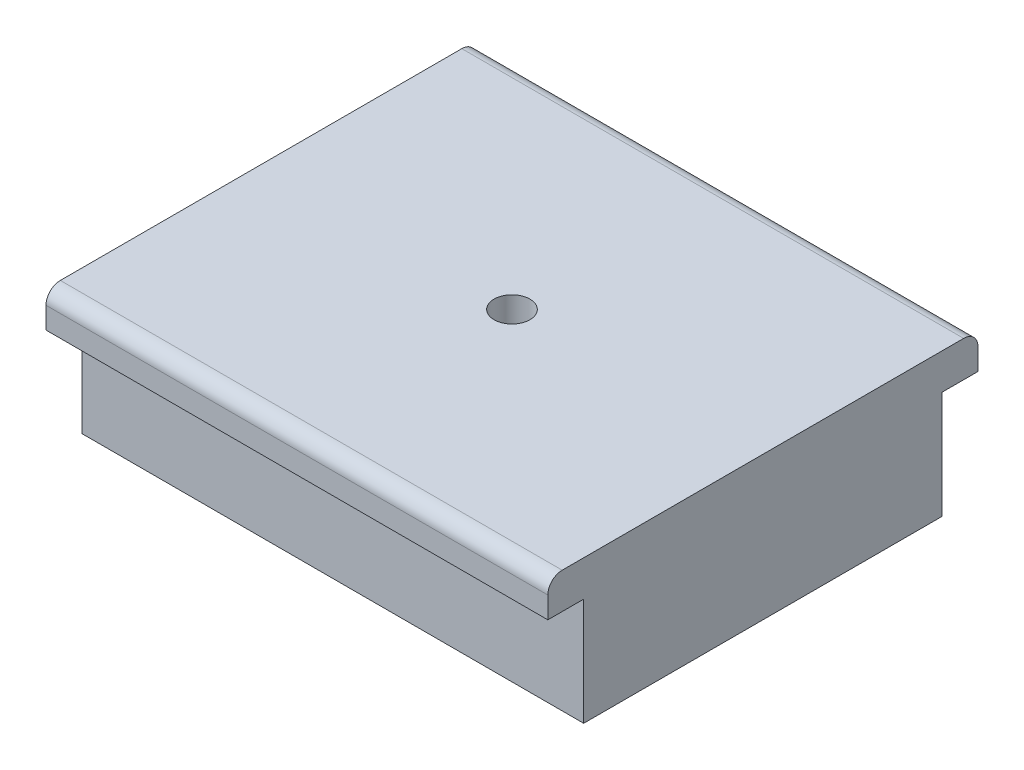
ISO-10303-21;
HEADER;
FILE_DESCRIPTION(('STEP AP214'),'2;1');
FILE_NAME('part.step','',(''),(''),'','','');
FILE_SCHEMA(('AUTOMOTIVE_DESIGN { 1 0 10303 214 1 1 1 1 }'));
ENDSEC;
DATA;
#1=APPLICATION_CONTEXT('core data for automotive mechanical design processes');
#2=APPLICATION_PROTOCOL_DEFINITION('international standard','automotive_design',2000,#1);
#3=PRODUCT_CONTEXT('',#1,'mechanical');
#4=PRODUCT('Part','Part','',(#3));
#5=PRODUCT_RELATED_PRODUCT_CATEGORY('part','',(#4));
#6=PRODUCT_DEFINITION_FORMATION('','',#4);
#7=PRODUCT_DEFINITION_CONTEXT('part definition',#1,'design');
#8=PRODUCT_DEFINITION('design','',#6,#7);
#9=PRODUCT_DEFINITION_SHAPE('','',#8);
#10=(LENGTH_UNIT() NAMED_UNIT(*) SI_UNIT(.MILLI.,.METRE.));
#11=(NAMED_UNIT(*) PLANE_ANGLE_UNIT() SI_UNIT($,.RADIAN.));
#12=(NAMED_UNIT(*) SI_UNIT($,.STERADIAN.) SOLID_ANGLE_UNIT());
#13=UNCERTAINTY_MEASURE_WITH_UNIT(LENGTH_MEASURE(1.E-05),#10,'distance_accuracy_value','');
#14=(GEOMETRIC_REPRESENTATION_CONTEXT(3) GLOBAL_UNCERTAINTY_ASSIGNED_CONTEXT((#13)) GLOBAL_UNIT_ASSIGNED_CONTEXT((#10,
#11,#12)) REPRESENTATION_CONTEXT('',''));
#15=CARTESIAN_POINT('',(0.,0.,0.));
#16=DIRECTION('',(0.,0.,1.));
#17=DIRECTION('',(1.,0.,0.));
#18=AXIS2_PLACEMENT_3D('',#15,#16,#17);
#19=CARTESIAN_POINT('',(-35.,-7.5,-25.));
#20=DIRECTION('',(-1.,0.,0.));
#21=DIRECTION('',(0.,0.,1.));
#22=AXIS2_PLACEMENT_3D('',#19,#20,#21);
#23=PLANE('',#22);
#24=DIRECTION('',(0.,0.,1.));
#25=VECTOR('',#24,1.);
#26=CARTESIAN_POINT('',(-35.,12.5,30.));
#27=LINE('',#26,#25);
#28=CARTESIAN_POINT('',(-35.,12.5,-28.));
#29=VERTEX_POINT('',#28);
#30=CARTESIAN_POINT('',(-35.,12.5,28.));
#31=VERTEX_POINT('',#30);
#32=EDGE_CURVE('E163',#29,#31,#27,.T.);
#33=ORIENTED_EDGE('',*,*,#32,.F.);
#34=CARTESIAN_POINT('',(-35.,10.5,-28.));
#35=DIRECTION('',(-1.,0.,0.));
#36=DIRECTION('',(0.,0.,1.));
#37=AXIS2_PLACEMENT_3D('',#34,#35,#36);
#38=CIRCLE('',#37,2.);
#39=CARTESIAN_POINT('',(-35.,10.5,-30.));
#40=VERTEX_POINT('',#39);
#41=EDGE_CURVE('E211',#29,#40,#38,.T.);
#42=ORIENTED_EDGE('',*,*,#41,.T.);
#43=DIRECTION('',(0.,-1.,0.));
#44=VECTOR('',#43,1.);
#45=CARTESIAN_POINT('',(-35.,12.5,-30.));
#46=LINE('',#45,#44);
#47=CARTESIAN_POINT('',(-35.,7.5,-30.));
#48=VERTEX_POINT('',#47);
#49=EDGE_CURVE('E126',#40,#48,#46,.T.);
#50=ORIENTED_EDGE('',*,*,#49,.T.);
#51=DIRECTION('',(0.,0.,1.));
#52=VECTOR('',#51,1.);
#53=CARTESIAN_POINT('',(-35.,7.5,30.));
#54=LINE('',#53,#52);
#55=CARTESIAN_POINT('',(-35.,7.5,-25.));
#56=VERTEX_POINT('',#55);
#57=EDGE_CURVE('E142',#48,#56,#54,.T.);
#58=ORIENTED_EDGE('',*,*,#57,.T.);
#59=DIRECTION('',(0.,1.,0.));
#60=VECTOR('',#59,1.);
#61=CARTESIAN_POINT('',(-35.,-7.5,-25.));
#62=LINE('',#61,#60);
#63=CARTESIAN_POINT('',(-35.,-7.5,-25.));
#64=VERTEX_POINT('',#63);
#65=EDGE_CURVE('E190',#64,#56,#62,.T.);
#66=ORIENTED_EDGE('',*,*,#65,.F.);
#67=DIRECTION('',(0.,0.,1.));
#68=VECTOR('',#67,1.);
#69=CARTESIAN_POINT('',(-35.,-7.5,-25.));
#70=LINE('',#69,#68);
#71=CARTESIAN_POINT('',(-35.,-7.5,25.));
#72=VERTEX_POINT('',#71);
#73=EDGE_CURVE('E174',#64,#72,#70,.T.);
#74=ORIENTED_EDGE('',*,*,#73,.T.);
#75=DIRECTION('',(0.,1.,0.));
#76=VECTOR('',#75,1.);
#77=CARTESIAN_POINT('',(-35.,-7.5,25.));
#78=LINE('',#77,#76);
#79=CARTESIAN_POINT('',(-35.,7.5,25.));
#80=VERTEX_POINT('',#79);
#81=EDGE_CURVE('E189',#72,#80,#78,.T.);
#82=ORIENTED_EDGE('',*,*,#81,.T.);
#83=CARTESIAN_POINT('',(-35.,7.5,30.));
#84=VERTEX_POINT('',#83);
#85=EDGE_CURVE('E144',#80,#84,#54,.T.);
#86=ORIENTED_EDGE('',*,*,#85,.T.);
#87=DIRECTION('',(0.,-1.,0.));
#88=VECTOR('',#87,1.);
#89=CARTESIAN_POINT('',(-35.,12.5,30.));
#90=LINE('',#89,#88);
#91=CARTESIAN_POINT('',(-35.,10.5,30.));
#92=VERTEX_POINT('',#91);
#93=EDGE_CURVE('E162',#92,#84,#90,.T.);
#94=ORIENTED_EDGE('',*,*,#93,.F.);
#95=CARTESIAN_POINT('',(-35.,10.5,28.));
#96=DIRECTION('',(-1.,0.,0.));
#97=DIRECTION('',(0.,0.,1.));
#98=AXIS2_PLACEMENT_3D('',#95,#96,#97);
#99=CIRCLE('',#98,2.);
#100=EDGE_CURVE('E208',#92,#31,#99,.T.);
#101=ORIENTED_EDGE('',*,*,#100,.T.);
#102=EDGE_LOOP('',(#33,#42,#50,#58,#66,#74,#82,#86,#94,#101));
#103=FACE_BOUND('',#102,.T.);
#104=ADVANCED_FACE('F41',(#103),#23,.T.);
#105=CARTESIAN_POINT('',(35.,-7.5,-25.));
#106=DIRECTION('',(0.,0.,-1.));
#107=DIRECTION('',(-1.,0.,0.));
#108=AXIS2_PLACEMENT_3D('',#105,#106,#107);
#109=PLANE('',#108);
#110=ORIENTED_EDGE('',*,*,#65,.T.);
#111=DIRECTION('',(-1.,0.,0.));
#112=VECTOR('',#111,1.);
#113=CARTESIAN_POINT('',(35.,7.5,-25.));
#114=LINE('',#113,#112);
#115=CARTESIAN_POINT('',(35.,7.5,-25.));
#116=VERTEX_POINT('',#115);
#117=EDGE_CURVE('E171',#116,#56,#114,.T.);
#118=ORIENTED_EDGE('',*,*,#117,.F.);
#119=DIRECTION('',(0.,1.,0.));
#120=VECTOR('',#119,1.);
#121=CARTESIAN_POINT('',(35.,-7.5,-25.));
#122=LINE('',#121,#120);
#123=CARTESIAN_POINT('',(35.,-7.5,-25.));
#124=VERTEX_POINT('',#123);
#125=EDGE_CURVE('E132',#124,#116,#122,.T.);
#126=ORIENTED_EDGE('',*,*,#125,.F.);
#127=DIRECTION('',(-1.,0.,0.));
#128=VECTOR('',#127,1.);
#129=CARTESIAN_POINT('',(35.,-7.5,-25.));
#130=LINE('',#129,#128);
#131=EDGE_CURVE('E185',#124,#64,#130,.T.);
#132=ORIENTED_EDGE('',*,*,#131,.T.);
#133=EDGE_LOOP('',(#110,#118,#126,#132));
#134=FACE_BOUND('',#133,.T.);
#135=ADVANCED_FACE('F262',(#134),#109,.T.);
#136=CARTESIAN_POINT('',(35.,-7.5,-25.));
#137=DIRECTION('',(1.,0.,0.));
#138=DIRECTION('',(0.,0.,-1.));
#139=AXIS2_PLACEMENT_3D('',#136,#137,#138);
#140=PLANE('',#139);
#141=DIRECTION('',(0.,-1.,0.));
#142=VECTOR('',#141,1.);
#143=CARTESIAN_POINT('',(35.,12.5,-30.));
#144=LINE('',#143,#142);
#145=CARTESIAN_POINT('',(35.,10.5,-30.));
#146=VERTEX_POINT('',#145);
#147=CARTESIAN_POINT('',(35.,7.5,-30.));
#148=VERTEX_POINT('',#147);
#149=EDGE_CURVE('E117',#146,#148,#144,.T.);
#150=ORIENTED_EDGE('',*,*,#149,.F.);
#151=CARTESIAN_POINT('',(35.,10.5,-28.));
#152=DIRECTION('',(1.,0.,0.));
#153=DIRECTION('',(0.,0.,-1.));
#154=AXIS2_PLACEMENT_3D('',#151,#152,#153);
#155=CIRCLE('',#154,2.);
#156=CARTESIAN_POINT('',(35.,12.5,-28.));
#157=VERTEX_POINT('',#156);
#158=EDGE_CURVE('E50',#146,#157,#155,.T.);
#159=ORIENTED_EDGE('',*,*,#158,.T.);
#160=DIRECTION('',(0.,0.,-1.));
#161=VECTOR('',#160,1.);
#162=CARTESIAN_POINT('',(35.,12.5,30.));
#163=LINE('',#162,#161);
#164=CARTESIAN_POINT('',(35.,12.5,28.));
#165=VERTEX_POINT('',#164);
#166=EDGE_CURVE('E158',#165,#157,#163,.T.);
#167=ORIENTED_EDGE('',*,*,#166,.F.);
#168=CARTESIAN_POINT('',(35.,10.5,28.));
#169=DIRECTION('',(1.,0.,0.));
#170=DIRECTION('',(0.,0.,-1.));
#171=AXIS2_PLACEMENT_3D('',#168,#169,#170);
#172=CIRCLE('',#171,2.);
#173=CARTESIAN_POINT('',(35.,10.5,30.));
#174=VERTEX_POINT('',#173);
#175=EDGE_CURVE('E57',#165,#174,#172,.T.);
#176=ORIENTED_EDGE('',*,*,#175,.T.);
#177=DIRECTION('',(0.,-1.,0.));
#178=VECTOR('',#177,1.);
#179=CARTESIAN_POINT('',(35.,12.5,30.));
#180=LINE('',#179,#178);
#181=CARTESIAN_POINT('',(35.,7.5,30.));
#182=VERTEX_POINT('',#181);
#183=EDGE_CURVE('E159',#174,#182,#180,.T.);
#184=ORIENTED_EDGE('',*,*,#183,.T.);
#185=DIRECTION('',(0.,0.,-1.));
#186=VECTOR('',#185,1.);
#187=CARTESIAN_POINT('',(35.,7.5,30.));
#188=LINE('',#187,#186);
#189=CARTESIAN_POINT('',(35.,7.5,25.));
#190=VERTEX_POINT('',#189);
#191=EDGE_CURVE('E137',#182,#190,#188,.T.);
#192=ORIENTED_EDGE('',*,*,#191,.T.);
#193=DIRECTION('',(0.,1.,0.));
#194=VECTOR('',#193,1.);
#195=CARTESIAN_POINT('',(35.,-7.5,25.));
#196=LINE('',#195,#194);
#197=CARTESIAN_POINT('',(35.,-7.5,25.));
#198=VERTEX_POINT('',#197);
#199=EDGE_CURVE('E196',#198,#190,#196,.T.);
#200=ORIENTED_EDGE('',*,*,#199,.F.);
#201=DIRECTION('',(0.,0.,-1.));
#202=VECTOR('',#201,1.);
#203=CARTESIAN_POINT('',(35.,-7.5,-25.));
#204=LINE('',#203,#202);
#205=EDGE_CURVE('E182',#198,#124,#204,.T.);
#206=ORIENTED_EDGE('',*,*,#205,.T.);
#207=ORIENTED_EDGE('',*,*,#125,.T.);
#208=EDGE_CURVE('E129',#116,#148,#188,.T.);
#209=ORIENTED_EDGE('',*,*,#208,.T.);
#210=EDGE_LOOP('',(#150,#159,#167,#176,#184,#192,#200,#206,#207,#209));
#211=FACE_BOUND('',#210,.T.);
#212=ADVANCED_FACE('F130',(#211),#140,.T.);
#213=CARTESIAN_POINT('',(35.,-7.5,25.));
#214=DIRECTION('',(0.,0.,1.));
#215=DIRECTION('',(1.,0.,0.));
#216=AXIS2_PLACEMENT_3D('',#213,#214,#215);
#217=PLANE('',#216);
#218=ORIENTED_EDGE('',*,*,#199,.T.);
#219=DIRECTION('',(1.,0.,0.));
#220=VECTOR('',#219,1.);
#221=CARTESIAN_POINT('',(35.,7.5,25.));
#222=LINE('',#221,#220);
#223=EDGE_CURVE('E125',#80,#190,#222,.T.);
#224=ORIENTED_EDGE('',*,*,#223,.F.);
#225=ORIENTED_EDGE('',*,*,#81,.F.);
#226=DIRECTION('',(1.,0.,0.));
#227=VECTOR('',#226,1.);
#228=CARTESIAN_POINT('',(35.,-7.5,25.));
#229=LINE('',#228,#227);
#230=EDGE_CURVE('E178',#72,#198,#229,.T.);
#231=ORIENTED_EDGE('',*,*,#230,.T.);
#232=EDGE_LOOP('',(#218,#224,#225,#231));
#233=FACE_BOUND('',#232,.T.);
#234=ADVANCED_FACE('F270',(#233),#217,.T.);
#235=CARTESIAN_POINT('',(0.,-7.5,0.));
#236=DIRECTION('',(0.,-1.,0.));
#237=DIRECTION('',(0.,0.,-1.));
#238=AXIS2_PLACEMENT_3D('',#235,#236,#237);
#239=PLANE('',#238);
#240=ORIENTED_EDGE('',*,*,#73,.F.);
#241=ORIENTED_EDGE('',*,*,#131,.F.);
#242=ORIENTED_EDGE('',*,*,#205,.F.);
#243=ORIENTED_EDGE('',*,*,#230,.F.);
#244=EDGE_LOOP('',(#240,#241,#242,#243));
#245=FACE_BOUND('',#244,.T.);
#246=ADVANCED_FACE('F291',(#245),#239,.T.);
#247=CARTESIAN_POINT('',(0.,7.5,0.));
#248=DIRECTION('',(0.,-1.,0.));
#249=DIRECTION('',(0.,0.,-1.));
#250=AXIS2_PLACEMENT_3D('',#247,#248,#249);
#251=PLANE('',#250);
#252=ORIENTED_EDGE('',*,*,#85,.F.);
#253=ORIENTED_EDGE('',*,*,#223,.T.);
#254=ORIENTED_EDGE('',*,*,#191,.F.);
#255=DIRECTION('',(1.,0.,0.));
#256=VECTOR('',#255,1.);
#257=CARTESIAN_POINT('',(-35.,7.5,30.));
#258=LINE('',#257,#256);
#259=EDGE_CURVE('E154',#84,#182,#258,.T.);
#260=ORIENTED_EDGE('',*,*,#259,.F.);
#261=EDGE_LOOP('',(#252,#253,#254,#260));
#262=FACE_BOUND('',#261,.T.);
#263=ADVANCED_FACE('F258',(#262),#251,.T.);
#264=CARTESIAN_POINT('',(-35.,12.5,-30.));
#265=DIRECTION('',(0.,0.,1.));
#266=DIRECTION('',(1.,0.,0.));
#267=AXIS2_PLACEMENT_3D('',#264,#265,#266);
#268=PLANE('',#267);
#269=ORIENTED_EDGE('',*,*,#49,.F.);
#270=DIRECTION('',(-1.,0.,0.));
#271=VECTOR('',#270,1.);
#272=CARTESIAN_POINT('',(-35.,10.5,-30.));
#273=LINE('',#272,#271);
#274=EDGE_CURVE('E65',#40,#146,#273,.F.);
#275=ORIENTED_EDGE('',*,*,#274,.T.);
#276=ORIENTED_EDGE('',*,*,#149,.T.);
#277=DIRECTION('',(-1.,0.,0.));
#278=VECTOR('',#277,1.);
#279=CARTESIAN_POINT('',(-35.,7.5,-30.));
#280=LINE('',#279,#278);
#281=EDGE_CURVE('E121',#148,#48,#280,.T.);
#282=ORIENTED_EDGE('',*,*,#281,.T.);
#283=EDGE_LOOP('',(#269,#275,#276,#282));
#284=FACE_BOUND('',#283,.T.);
#285=ADVANCED_FACE('F119',(#284),#268,.F.);
#286=CARTESIAN_POINT('',(-35.,12.5,30.));
#287=DIRECTION('',(0.,0.,-1.));
#288=DIRECTION('',(-1.,0.,0.));
#289=AXIS2_PLACEMENT_3D('',#286,#287,#288);
#290=PLANE('',#289);
#291=ORIENTED_EDGE('',*,*,#183,.F.);
#292=DIRECTION('',(1.,0.,0.));
#293=VECTOR('',#292,1.);
#294=CARTESIAN_POINT('',(-35.,10.5,30.));
#295=LINE('',#294,#293);
#296=EDGE_CURVE('E11',#174,#92,#295,.F.);
#297=ORIENTED_EDGE('',*,*,#296,.T.);
#298=ORIENTED_EDGE('',*,*,#93,.T.);
#299=ORIENTED_EDGE('',*,*,#259,.T.);
#300=EDGE_LOOP('',(#291,#297,#298,#299));
#301=FACE_BOUND('',#300,.T.);
#302=ADVANCED_FACE('F251',(#301),#290,.F.);
#303=CARTESIAN_POINT('',(0.,12.5,0.));
#304=DIRECTION('',(0.,-1.,0.));
#305=DIRECTION('',(0.,0.,-1.));
#306=AXIS2_PLACEMENT_3D('',#303,#304,#305);
#307=PLANE('',#306);
#308=CARTESIAN_POINT('',(0.,12.5,0.));
#309=DIRECTION('',(0.,1.,0.));
#310=DIRECTION('',(0.,0.,1.));
#311=AXIS2_PLACEMENT_3D('',#308,#309,#310);
#312=CIRCLE('',#311,2.5);
#313=CARTESIAN_POINT('',(0.,12.5,2.5));
#314=VERTEX_POINT('',#313);
#315=EDGE_CURVE('E234',#314,#314,#312,.T.);
#316=ORIENTED_EDGE('',*,*,#315,.F.);
#317=EDGE_LOOP('',(#316));
#318=FACE_BOUND('',#317,.T.);
#319=ORIENTED_EDGE('',*,*,#166,.T.);
#320=DIRECTION('',(-1.,0.,0.));
#321=VECTOR('',#320,1.);
#322=CARTESIAN_POINT('',(0.,12.5,-28.));
#323=LINE('',#322,#321);
#324=EDGE_CURVE('E204',#157,#29,#323,.T.);
#325=ORIENTED_EDGE('',*,*,#324,.T.);
#326=ORIENTED_EDGE('',*,*,#32,.T.);
#327=DIRECTION('',(1.,0.,0.));
#328=VECTOR('',#327,1.);
#329=CARTESIAN_POINT('',(0.,12.5,28.));
#330=LINE('',#329,#328);
#331=EDGE_CURVE('E193',#31,#165,#330,.T.);
#332=ORIENTED_EDGE('',*,*,#331,.T.);
#333=EDGE_LOOP('',(#319,#325,#326,#332));
#334=FACE_BOUND('',#333,.T.);
#335=ADVANCED_FACE('F222',(#318,#334),#307,.F.);
#336=ORIENTED_EDGE('',*,*,#208,.F.);
#337=ORIENTED_EDGE('',*,*,#117,.T.);
#338=ORIENTED_EDGE('',*,*,#57,.F.);
#339=ORIENTED_EDGE('',*,*,#281,.F.);
#340=EDGE_LOOP('',(#336,#337,#338,#339));
#341=FACE_BOUND('',#340,.T.);
#342=ADVANCED_FACE('F140',(#341),#251,.T.);
#343=CARTESIAN_POINT('',(0.,10.5,-28.));
#344=DIRECTION('',(-1.,0.,0.));
#345=DIRECTION('',(0.,0.,1.));
#346=AXIS2_PLACEMENT_3D('',#343,#344,#345);
#347=CYLINDRICAL_SURFACE('',#346,2.);
#348=ORIENTED_EDGE('',*,*,#158,.F.);
#349=ORIENTED_EDGE('',*,*,#274,.F.);
#350=ORIENTED_EDGE('',*,*,#41,.F.);
#351=ORIENTED_EDGE('',*,*,#324,.F.);
#352=EDGE_LOOP('',(#348,#349,#350,#351));
#353=FACE_BOUND('',#352,.T.);
#354=ADVANCED_FACE('F228',(#353),#347,.T.);
#355=CARTESIAN_POINT('',(0.,10.5,28.));
#356=DIRECTION('',(1.,0.,0.));
#357=DIRECTION('',(0.,0.,-1.));
#358=AXIS2_PLACEMENT_3D('',#355,#356,#357);
#359=CYLINDRICAL_SURFACE('',#358,2.);
#360=ORIENTED_EDGE('',*,*,#100,.F.);
#361=ORIENTED_EDGE('',*,*,#296,.F.);
#362=ORIENTED_EDGE('',*,*,#175,.F.);
#363=ORIENTED_EDGE('',*,*,#331,.F.);
#364=EDGE_LOOP('',(#360,#361,#362,#363));
#365=FACE_BOUND('',#364,.T.);
#366=ADVANCED_FACE('F43',(#365),#359,.T.);
#367=CARTESIAN_POINT('',(0.,2.5,0.));
#368=DIRECTION('',(0.,1.,0.));
#369=DIRECTION('',(0.,0.,1.));
#370=AXIS2_PLACEMENT_3D('',#367,#368,#369);
#371=CYLINDRICAL_SURFACE('',#370,2.5);
#372=CARTESIAN_POINT('',(0.,2.5,0.));
#373=DIRECTION('',(0.,1.,0.));
#374=DIRECTION('',(0.,0.,1.));
#375=AXIS2_PLACEMENT_3D('',#372,#373,#374);
#376=CIRCLE('',#375,2.5);
#377=CARTESIAN_POINT('',(0.,2.5,2.5));
#378=VERTEX_POINT('',#377);
#379=EDGE_CURVE('E138',#378,#378,#376,.T.);
#380=ORIENTED_EDGE('',*,*,#379,.F.);
#381=EDGE_LOOP('',(#380));
#382=FACE_BOUND('',#381,.T.);
#383=ORIENTED_EDGE('',*,*,#315,.T.);
#384=EDGE_LOOP('',(#383));
#385=FACE_BOUND('',#384,.T.);
#386=ADVANCED_FACE('F244',(#382,#385),#371,.F.);
#387=CARTESIAN_POINT('',(0.,2.5,0.));
#388=DIRECTION('',(0.,1.,0.));
#389=DIRECTION('',(0.,0.,1.));
#390=AXIS2_PLACEMENT_3D('',#387,#388,#389);
#391=PLANE('',#390);
#392=ORIENTED_EDGE('',*,*,#379,.T.);
#393=EDGE_LOOP('',(#392));
#394=FACE_BOUND('',#393,.T.);
#395=ADVANCED_FACE('F242',(#394),#391,.T.);
#396=CLOSED_SHELL('',(#104,#135,#212,#234,#246,#263,#285,#302,#335,#342,#354,#366,#386,#395));
#397=MANIFOLD_SOLID_BREP('B2',#396);
#398=ADVANCED_BREP_SHAPE_REPRESENTATION('',(#18,#397),#14);
#399=SHAPE_DEFINITION_REPRESENTATION(#9,#398);
ENDSEC;
END-ISO-10303-21;
